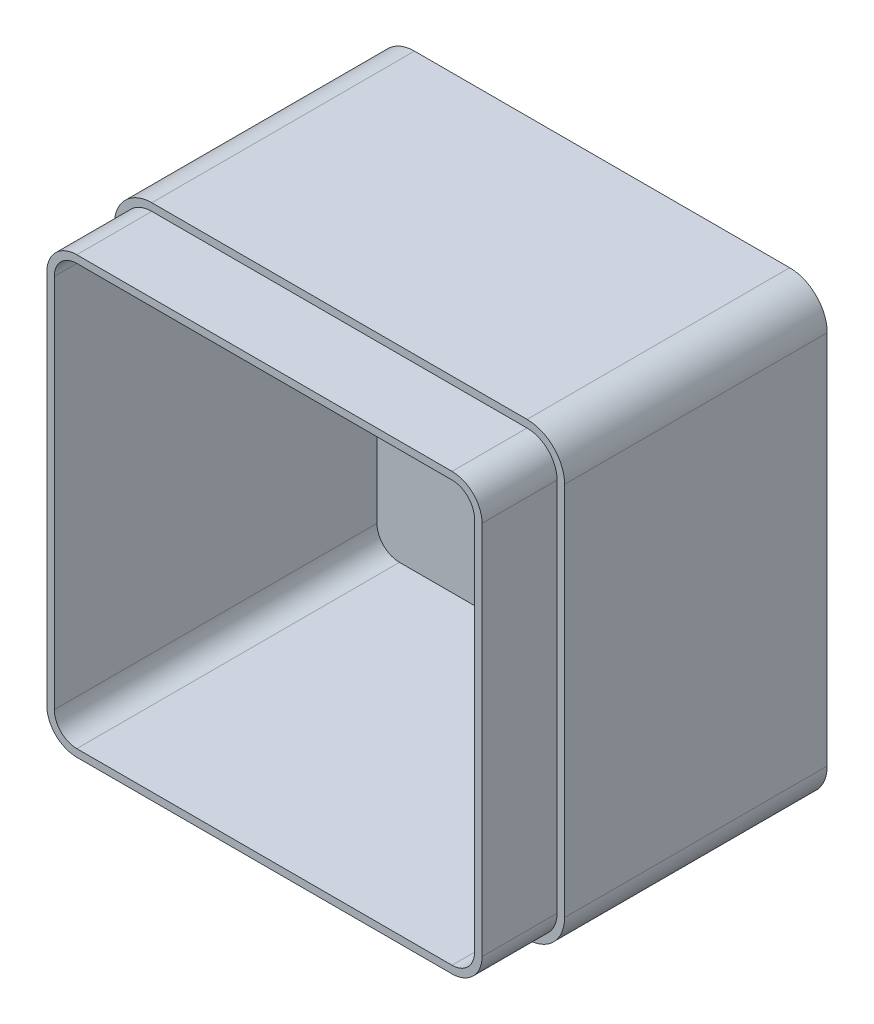
ISO-10303-21;
HEADER;
FILE_DESCRIPTION(('STEP AP214'),'2;1');
FILE_NAME('part.step','',(''),(''),'','','');
FILE_SCHEMA(('AUTOMOTIVE_DESIGN { 1 0 10303 214 1 1 1 1 }'));
ENDSEC;
DATA;
#1=APPLICATION_CONTEXT('core data for automotive mechanical design processes');
#2=APPLICATION_PROTOCOL_DEFINITION('international standard','automotive_design',2000,#1);
#3=PRODUCT_CONTEXT('',#1,'mechanical');
#4=PRODUCT('Part','Part','',(#3));
#5=PRODUCT_RELATED_PRODUCT_CATEGORY('part','',(#4));
#6=PRODUCT_DEFINITION_FORMATION('','',#4);
#7=PRODUCT_DEFINITION_CONTEXT('part definition',#1,'design');
#8=PRODUCT_DEFINITION('design','',#6,#7);
#9=PRODUCT_DEFINITION_SHAPE('','',#8);
#10=(LENGTH_UNIT() NAMED_UNIT(*) SI_UNIT(.MILLI.,.METRE.));
#11=(NAMED_UNIT(*) PLANE_ANGLE_UNIT() SI_UNIT($,.RADIAN.));
#12=(NAMED_UNIT(*) SI_UNIT($,.STERADIAN.) SOLID_ANGLE_UNIT());
#13=UNCERTAINTY_MEASURE_WITH_UNIT(LENGTH_MEASURE(1.E-05),#10,'distance_accuracy_value','');
#14=(GEOMETRIC_REPRESENTATION_CONTEXT(3) GLOBAL_UNCERTAINTY_ASSIGNED_CONTEXT((#13)) GLOBAL_UNIT_ASSIGNED_CONTEXT((#10,
#11,#12)) REPRESENTATION_CONTEXT('',''));
#15=CARTESIAN_POINT('',(0.,0.,0.));
#16=DIRECTION('',(0.,0.,1.));
#17=DIRECTION('',(1.,0.,0.));
#18=AXIS2_PLACEMENT_3D('',#15,#16,#17);
#19=CARTESIAN_POINT('',(0.,0.,90.));
#20=DIRECTION('',(0.,0.,1.));
#21=DIRECTION('',(1.,0.,0.));
#22=AXIS2_PLACEMENT_3D('',#19,#20,#21);
#23=PLANE('',#22);
#24=DIRECTION('',(0.,-1.,0.));
#25=VECTOR('',#24,1.);
#26=CARTESIAN_POINT('',(-116.,120.,90.));
#27=LINE('',#26,#25);
#28=CARTESIAN_POINT('',(-116.,110.,90.));
#29=VERTEX_POINT('',#28);
#30=CARTESIAN_POINT('',(-116.,9.99999999999999,90.));
#31=VERTEX_POINT('',#30);
#32=EDGE_CURVE('E349',#29,#31,#27,.T.);
#33=ORIENTED_EDGE('',*,*,#32,.F.);
#34=CARTESIAN_POINT('',(-110.,110.,90.));
#35=DIRECTION('',(0.,0.,1.));
#36=DIRECTION('',(1.,0.,0.));
#37=AXIS2_PLACEMENT_3D('',#34,#35,#36);
#38=CIRCLE('',#37,6.);
#39=CARTESIAN_POINT('',(-110.,116.,90.));
#40=VERTEX_POINT('',#39);
#41=EDGE_CURVE('E389',#40,#29,#38,.T.);
#42=ORIENTED_EDGE('',*,*,#41,.F.);
#43=DIRECTION('',(-1.,0.,0.));
#44=VECTOR('',#43,1.);
#45=CARTESIAN_POINT('',(-120.,116.,90.));
#46=LINE('',#45,#44);
#47=CARTESIAN_POINT('',(-10.,116.,90.));
#48=VERTEX_POINT('',#47);
#49=EDGE_CURVE('E365',#48,#40,#46,.T.);
#50=ORIENTED_EDGE('',*,*,#49,.F.);
#51=CARTESIAN_POINT('',(-9.99999999999999,110.,90.));
#52=DIRECTION('',(0.,0.,1.));
#53=DIRECTION('',(1.,0.,0.));
#54=AXIS2_PLACEMENT_3D('',#51,#52,#53);
#55=CIRCLE('',#54,6.);
#56=CARTESIAN_POINT('',(-4.,110.,90.));
#57=VERTEX_POINT('',#56);
#58=EDGE_CURVE('E396',#57,#48,#55,.T.);
#59=ORIENTED_EDGE('',*,*,#58,.F.);
#60=DIRECTION('',(0.,1.,0.));
#61=VECTOR('',#60,1.);
#62=CARTESIAN_POINT('',(-4.,120.,90.));
#63=LINE('',#62,#61);
#64=CARTESIAN_POINT('',(-4.,10.,90.));
#65=VERTEX_POINT('',#64);
#66=EDGE_CURVE('E393',#65,#57,#63,.T.);
#67=ORIENTED_EDGE('',*,*,#66,.F.);
#68=CARTESIAN_POINT('',(-10.,9.99999999999999,90.));
#69=DIRECTION('',(0.,0.,1.));
#70=DIRECTION('',(1.,0.,0.));
#71=AXIS2_PLACEMENT_3D('',#68,#69,#70);
#72=CIRCLE('',#71,6.);
#73=CARTESIAN_POINT('',(-9.99999999999999,4.,90.));
#74=VERTEX_POINT('',#73);
#75=EDGE_CURVE('E329',#74,#65,#72,.T.);
#76=ORIENTED_EDGE('',*,*,#75,.F.);
#77=DIRECTION('',(1.,0.,0.));
#78=VECTOR('',#77,1.);
#79=CARTESIAN_POINT('',(-120.,4.,90.));
#80=LINE('',#79,#78);
#81=CARTESIAN_POINT('',(-110.,4.,90.));
#82=VERTEX_POINT('',#81);
#83=EDGE_CURVE('E386',#82,#74,#80,.T.);
#84=ORIENTED_EDGE('',*,*,#83,.F.);
#85=CARTESIAN_POINT('',(-110.,10.,90.));
#86=DIRECTION('',(0.,0.,1.));
#87=DIRECTION('',(1.,0.,0.));
#88=AXIS2_PLACEMENT_3D('',#85,#86,#87);
#89=CIRCLE('',#88,6.);
#90=EDGE_CURVE('E379',#31,#82,#89,.T.);
#91=ORIENTED_EDGE('',*,*,#90,.F.);
#92=EDGE_LOOP('',(#33,#42,#50,#59,#67,#76,#84,#91));
#93=FACE_BOUND('',#92,.T.);
#94=DIRECTION('',(-1.,0.,0.));
#95=VECTOR('',#94,1.);
#96=CARTESIAN_POINT('',(-9.99999999999999,118.,90.));
#97=LINE('',#96,#95);
#98=CARTESIAN_POINT('',(-9.99999999999999,118.,90.));
#99=VERTEX_POINT('',#98);
#100=CARTESIAN_POINT('',(-110.,118.,90.));
#101=VERTEX_POINT('',#100);
#102=EDGE_CURVE('E230',#99,#101,#97,.T.);
#103=ORIENTED_EDGE('',*,*,#102,.T.);
#104=CARTESIAN_POINT('',(-110.,110.,90.));
#105=DIRECTION('',(0.,0.,1.));
#106=DIRECTION('',(1.,0.,0.));
#107=AXIS2_PLACEMENT_3D('',#104,#105,#106);
#108=CIRCLE('',#107,7.99999999999999);
#109=CARTESIAN_POINT('',(-118.,110.,90.));
#110=VERTEX_POINT('',#109);
#111=EDGE_CURVE('E257',#101,#110,#108,.T.);
#112=ORIENTED_EDGE('',*,*,#111,.T.);
#113=DIRECTION('',(0.,-1.,0.));
#114=VECTOR('',#113,1.);
#115=CARTESIAN_POINT('',(-118.,110.,90.));
#116=LINE('',#115,#114);
#117=CARTESIAN_POINT('',(-118.,9.99999999999999,90.));
#118=VERTEX_POINT('',#117);
#119=EDGE_CURVE('E207',#110,#118,#116,.T.);
#120=ORIENTED_EDGE('',*,*,#119,.T.);
#121=CARTESIAN_POINT('',(-110.,10.,90.));
#122=DIRECTION('',(0.,0.,1.));
#123=DIRECTION('',(1.,0.,0.));
#124=AXIS2_PLACEMENT_3D('',#121,#122,#123);
#125=CIRCLE('',#124,7.99999999999998);
#126=CARTESIAN_POINT('',(-110.,2.00000000000002,90.));
#127=VERTEX_POINT('',#126);
#128=EDGE_CURVE('E55',#118,#127,#125,.T.);
#129=ORIENTED_EDGE('',*,*,#128,.T.);
#130=DIRECTION('',(1.,0.,0.));
#131=VECTOR('',#130,1.);
#132=CARTESIAN_POINT('',(-110.,2.,90.));
#133=LINE('',#132,#131);
#134=CARTESIAN_POINT('',(-9.99999999999999,2.,90.));
#135=VERTEX_POINT('',#134);
#136=EDGE_CURVE('E264',#127,#135,#133,.T.);
#137=ORIENTED_EDGE('',*,*,#136,.T.);
#138=CARTESIAN_POINT('',(-10.,9.99999999999999,90.));
#139=DIRECTION('',(0.,0.,1.));
#140=DIRECTION('',(1.,0.,0.));
#141=AXIS2_PLACEMENT_3D('',#138,#139,#140);
#142=CIRCLE('',#141,8.);
#143=CARTESIAN_POINT('',(-2.,9.99999999999999,90.));
#144=VERTEX_POINT('',#143);
#145=EDGE_CURVE('E268',#135,#144,#142,.T.);
#146=ORIENTED_EDGE('',*,*,#145,.T.);
#147=DIRECTION('',(0.,1.,0.));
#148=VECTOR('',#147,1.);
#149=CARTESIAN_POINT('',(-2.,9.99999999999999,90.));
#150=LINE('',#149,#148);
#151=CARTESIAN_POINT('',(-2.,110.,90.));
#152=VERTEX_POINT('',#151);
#153=EDGE_CURVE('E272',#144,#152,#150,.T.);
#154=ORIENTED_EDGE('',*,*,#153,.T.);
#155=CARTESIAN_POINT('',(-9.99999999999999,110.,90.));
#156=DIRECTION('',(0.,0.,1.));
#157=DIRECTION('',(1.,0.,0.));
#158=AXIS2_PLACEMENT_3D('',#155,#156,#157);
#159=CIRCLE('',#158,7.99999999999999);
#160=EDGE_CURVE('E234',#152,#99,#159,.T.);
#161=ORIENTED_EDGE('',*,*,#160,.T.);
#162=EDGE_LOOP('',(#103,#112,#120,#129,#137,#146,#154,#161));
#163=FACE_BOUND('',#162,.T.);
#164=ADVANCED_FACE('F39',(#93,#163),#23,.T.);
#165=CARTESIAN_POINT('',(-116.,120.,90.));
#166=DIRECTION('',(1.,0.,0.));
#167=DIRECTION('',(0.,1.,0.));
#168=AXIS2_PLACEMENT_3D('',#165,#166,#167);
#169=PLANE('',#168);
#170=DIRECTION('',(0.,-1.,0.));
#171=VECTOR('',#170,1.);
#172=CARTESIAN_POINT('',(-116.,120.,4.));
#173=LINE('',#172,#171);
#174=CARTESIAN_POINT('',(-116.,110.,4.));
#175=VERTEX_POINT('',#174);
#176=CARTESIAN_POINT('',(-116.,9.99999999999999,4.));
#177=VERTEX_POINT('',#176);
#178=EDGE_CURVE('E321',#175,#177,#173,.T.);
#179=ORIENTED_EDGE('',*,*,#178,.F.);
#180=DIRECTION('',(0.,0.,1.));
#181=VECTOR('',#180,1.);
#182=CARTESIAN_POINT('',(-116.,110.,90.));
#183=LINE('',#182,#181);
#184=EDGE_CURVE('E330',#29,#175,#183,.F.);
#185=ORIENTED_EDGE('',*,*,#184,.F.);
#186=ORIENTED_EDGE('',*,*,#32,.T.);
#187=DIRECTION('',(0.,0.,1.));
#188=VECTOR('',#187,1.);
#189=CARTESIAN_POINT('',(-116.,9.99999999999999,90.));
#190=LINE('',#189,#188);
#191=EDGE_CURVE('E326',#177,#31,#190,.T.);
#192=ORIENTED_EDGE('',*,*,#191,.F.);
#193=EDGE_LOOP('',(#179,#185,#186,#192));
#194=FACE_BOUND('',#193,.T.);
#195=ADVANCED_FACE('F503',(#194),#169,.T.);
#196=CARTESIAN_POINT('',(-120.,4.,90.));
#197=DIRECTION('',(0.,1.,0.));
#198=DIRECTION('',(-1.,0.,0.));
#199=AXIS2_PLACEMENT_3D('',#196,#197,#198);
#200=PLANE('',#199);
#201=ORIENTED_EDGE('',*,*,#83,.T.);
#202=DIRECTION('',(0.,0.,1.));
#203=VECTOR('',#202,1.);
#204=CARTESIAN_POINT('',(-9.99999999999999,4.,90.));
#205=LINE('',#204,#203);
#206=CARTESIAN_POINT('',(-9.99999999999999,4.,4.));
#207=VERTEX_POINT('',#206);
#208=EDGE_CURVE('E362',#207,#74,#205,.T.);
#209=ORIENTED_EDGE('',*,*,#208,.F.);
#210=DIRECTION('',(1.,0.,0.));
#211=VECTOR('',#210,1.);
#212=CARTESIAN_POINT('',(-120.,4.,4.));
#213=LINE('',#212,#211);
#214=CARTESIAN_POINT('',(-110.,4.,4.));
#215=VERTEX_POINT('',#214);
#216=EDGE_CURVE('E325',#215,#207,#213,.T.);
#217=ORIENTED_EDGE('',*,*,#216,.F.);
#218=DIRECTION('',(0.,0.,1.));
#219=VECTOR('',#218,1.);
#220=CARTESIAN_POINT('',(-110.,4.,90.));
#221=LINE('',#220,#219);
#222=EDGE_CURVE('E358',#82,#215,#221,.F.);
#223=ORIENTED_EDGE('',*,*,#222,.F.);
#224=EDGE_LOOP('',(#201,#209,#217,#223));
#225=FACE_BOUND('',#224,.T.);
#226=ADVANCED_FACE('F509',(#225),#200,.T.);
#227=CARTESIAN_POINT('',(-4.,120.,90.));
#228=DIRECTION('',(-1.,0.,0.));
#229=DIRECTION('',(0.,0.,1.));
#230=AXIS2_PLACEMENT_3D('',#227,#228,#229);
#231=PLANE('',#230);
#232=DIRECTION('',(0.,1.,0.));
#233=VECTOR('',#232,1.);
#234=CARTESIAN_POINT('',(-4.,120.,4.));
#235=LINE('',#234,#233);
#236=CARTESIAN_POINT('',(-4.,10.,4.));
#237=VERTEX_POINT('',#236);
#238=CARTESIAN_POINT('',(-4.,110.,4.));
#239=VERTEX_POINT('',#238);
#240=EDGE_CURVE('E338',#237,#239,#235,.T.);
#241=ORIENTED_EDGE('',*,*,#240,.F.);
#242=DIRECTION('',(0.,0.,1.));
#243=VECTOR('',#242,1.);
#244=CARTESIAN_POINT('',(-4.,10.,90.));
#245=LINE('',#244,#243);
#246=EDGE_CURVE('E366',#65,#237,#245,.F.);
#247=ORIENTED_EDGE('',*,*,#246,.F.);
#248=ORIENTED_EDGE('',*,*,#66,.T.);
#249=DIRECTION('',(0.,0.,1.));
#250=VECTOR('',#249,1.);
#251=CARTESIAN_POINT('',(-4.,110.,90.));
#252=LINE('',#251,#250);
#253=EDGE_CURVE('E370',#239,#57,#252,.T.);
#254=ORIENTED_EDGE('',*,*,#253,.F.);
#255=EDGE_LOOP('',(#241,#247,#248,#254));
#256=FACE_BOUND('',#255,.T.);
#257=ADVANCED_FACE('F656',(#256),#231,.T.);
#258=CARTESIAN_POINT('',(-120.,116.,90.));
#259=DIRECTION('',(0.,-1.,0.));
#260=DIRECTION('',(0.,0.,-1.));
#261=AXIS2_PLACEMENT_3D('',#258,#259,#260);
#262=PLANE('',#261);
#263=DIRECTION('',(-1.,0.,0.));
#264=VECTOR('',#263,1.);
#265=CARTESIAN_POINT('',(-120.,116.,4.));
#266=LINE('',#265,#264);
#267=CARTESIAN_POINT('',(-10.,116.,4.));
#268=VERTEX_POINT('',#267);
#269=CARTESIAN_POINT('',(-110.,116.,4.));
#270=VERTEX_POINT('',#269);
#271=EDGE_CURVE('E345',#268,#270,#266,.T.);
#272=ORIENTED_EDGE('',*,*,#271,.F.);
#273=DIRECTION('',(0.,0.,-1.));
#274=VECTOR('',#273,1.);
#275=CARTESIAN_POINT('',(-10.,116.,90.));
#276=LINE('',#275,#274);
#277=EDGE_CURVE('E375',#48,#268,#276,.T.);
#278=ORIENTED_EDGE('',*,*,#277,.F.);
#279=ORIENTED_EDGE('',*,*,#49,.T.);
#280=DIRECTION('',(0.,0.,-1.));
#281=VECTOR('',#280,1.);
#282=CARTESIAN_POINT('',(-110.,116.,90.));
#283=LINE('',#282,#281);
#284=EDGE_CURVE('E371',#270,#40,#283,.F.);
#285=ORIENTED_EDGE('',*,*,#284,.F.);
#286=EDGE_LOOP('',(#272,#278,#279,#285));
#287=FACE_BOUND('',#286,.T.);
#288=ADVANCED_FACE('F648',(#287),#262,.T.);
#289=CARTESIAN_POINT('',(0.,0.,4.));
#290=DIRECTION('',(0.,0.,1.));
#291=DIRECTION('',(1.,0.,0.));
#292=AXIS2_PLACEMENT_3D('',#289,#290,#291);
#293=PLANE('',#292);
#294=ORIENTED_EDGE('',*,*,#216,.T.);
#295=CARTESIAN_POINT('',(-10.,9.99999999999999,4.));
#296=DIRECTION('',(0.,0.,1.));
#297=DIRECTION('',(1.,0.,0.));
#298=AXIS2_PLACEMENT_3D('',#295,#296,#297);
#299=CIRCLE('',#298,6.);
#300=EDGE_CURVE('E352',#237,#207,#299,.F.);
#301=ORIENTED_EDGE('',*,*,#300,.F.);
#302=ORIENTED_EDGE('',*,*,#240,.T.);
#303=CARTESIAN_POINT('',(-9.99999999999999,110.,4.));
#304=DIRECTION('',(0.,0.,1.));
#305=DIRECTION('',(1.,0.,0.));
#306=AXIS2_PLACEMENT_3D('',#303,#304,#305);
#307=CIRCLE('',#306,6.);
#308=EDGE_CURVE('E344',#268,#239,#307,.F.);
#309=ORIENTED_EDGE('',*,*,#308,.F.);
#310=ORIENTED_EDGE('',*,*,#271,.T.);
#311=CARTESIAN_POINT('',(-110.,110.,4.));
#312=DIRECTION('',(0.,0.,1.));
#313=DIRECTION('',(1.,0.,0.));
#314=AXIS2_PLACEMENT_3D('',#311,#312,#313);
#315=CIRCLE('',#314,6.);
#316=EDGE_CURVE('E341',#175,#270,#315,.F.);
#317=ORIENTED_EDGE('',*,*,#316,.F.);
#318=ORIENTED_EDGE('',*,*,#178,.T.);
#319=CARTESIAN_POINT('',(-110.,10.,4.));
#320=DIRECTION('',(0.,0.,1.));
#321=DIRECTION('',(1.,0.,0.));
#322=AXIS2_PLACEMENT_3D('',#319,#320,#321);
#323=CIRCLE('',#322,6.);
#324=EDGE_CURVE('E334',#215,#177,#323,.F.);
#325=ORIENTED_EDGE('',*,*,#324,.F.);
#326=EDGE_LOOP('',(#294,#301,#302,#309,#310,#317,#318,#325));
#327=FACE_BOUND('',#326,.T.);
#328=ADVANCED_FACE('F640',(#327),#293,.T.);
#329=CARTESIAN_POINT('',(-110.,10.,90.));
#330=DIRECTION('',(0.,0.,-1.));
#331=DIRECTION('',(-1.,0.,0.));
#332=AXIS2_PLACEMENT_3D('',#329,#330,#331);
#333=CYLINDRICAL_SURFACE('',#332,6.);
#334=ORIENTED_EDGE('',*,*,#90,.T.);
#335=ORIENTED_EDGE('',*,*,#222,.T.);
#336=ORIENTED_EDGE('',*,*,#324,.T.);
#337=ORIENTED_EDGE('',*,*,#191,.T.);
#338=EDGE_LOOP('',(#334,#335,#336,#337));
#339=FACE_BOUND('',#338,.T.);
#340=ADVANCED_FACE('F632',(#339),#333,.F.);
#341=CARTESIAN_POINT('',(-110.,110.,90.));
#342=DIRECTION('',(0.,0.,-1.));
#343=DIRECTION('',(-1.,0.,0.));
#344=AXIS2_PLACEMENT_3D('',#341,#342,#343);
#345=CYLINDRICAL_SURFACE('',#344,6.);
#346=ORIENTED_EDGE('',*,*,#41,.T.);
#347=ORIENTED_EDGE('',*,*,#184,.T.);
#348=ORIENTED_EDGE('',*,*,#316,.T.);
#349=ORIENTED_EDGE('',*,*,#284,.T.);
#350=EDGE_LOOP('',(#346,#347,#348,#349));
#351=FACE_BOUND('',#350,.T.);
#352=ADVANCED_FACE('F625',(#351),#345,.F.);
#353=CARTESIAN_POINT('',(-9.99999999999999,110.,90.));
#354=DIRECTION('',(0.,0.,-1.));
#355=DIRECTION('',(-1.,0.,0.));
#356=AXIS2_PLACEMENT_3D('',#353,#354,#355);
#357=CYLINDRICAL_SURFACE('',#356,6.);
#358=ORIENTED_EDGE('',*,*,#58,.T.);
#359=ORIENTED_EDGE('',*,*,#277,.T.);
#360=ORIENTED_EDGE('',*,*,#308,.T.);
#361=ORIENTED_EDGE('',*,*,#253,.T.);
#362=EDGE_LOOP('',(#358,#359,#360,#361));
#363=FACE_BOUND('',#362,.T.);
#364=ADVANCED_FACE('F618',(#363),#357,.F.);
#365=CARTESIAN_POINT('',(-10.,9.99999999999999,90.));
#366=DIRECTION('',(0.,0.,-1.));
#367=DIRECTION('',(-1.,0.,0.));
#368=AXIS2_PLACEMENT_3D('',#365,#366,#367);
#369=CYLINDRICAL_SURFACE('',#368,6.);
#370=ORIENTED_EDGE('',*,*,#75,.T.);
#371=ORIENTED_EDGE('',*,*,#246,.T.);
#372=ORIENTED_EDGE('',*,*,#300,.T.);
#373=ORIENTED_EDGE('',*,*,#208,.T.);
#374=EDGE_LOOP('',(#370,#371,#372,#373));
#375=FACE_BOUND('',#374,.T.);
#376=ADVANCED_FACE('F516',(#375),#369,.F.);
#377=CARTESIAN_POINT('',(-110.,110.,70.));
#378=DIRECTION('',(0.,0.,1.));
#379=DIRECTION('',(1.,0.,0.));
#380=AXIS2_PLACEMENT_3D('',#377,#378,#379);
#381=PLANE('',#380);
#382=DIRECTION('',(-1.,0.,0.));
#383=VECTOR('',#382,1.);
#384=CARTESIAN_POINT('',(-9.99999999999999,118.,70.));
#385=LINE('',#384,#383);
#386=CARTESIAN_POINT('',(-9.99999999999999,118.,70.));
#387=VERTEX_POINT('',#386);
#388=CARTESIAN_POINT('',(-110.,118.,70.));
#389=VERTEX_POINT('',#388);
#390=EDGE_CURVE('E214',#387,#389,#385,.T.);
#391=ORIENTED_EDGE('',*,*,#390,.F.);
#392=CARTESIAN_POINT('',(-9.99999999999999,110.,70.));
#393=DIRECTION('',(0.,0.,1.));
#394=DIRECTION('',(1.,0.,0.));
#395=AXIS2_PLACEMENT_3D('',#392,#393,#394);
#396=CIRCLE('',#395,7.99999999999999);
#397=CARTESIAN_POINT('',(-2.,110.,70.));
#398=VERTEX_POINT('',#397);
#399=EDGE_CURVE('E251',#398,#387,#396,.T.);
#400=ORIENTED_EDGE('',*,*,#399,.F.);
#401=DIRECTION('',(0.,1.,0.));
#402=VECTOR('',#401,1.);
#403=CARTESIAN_POINT('',(-2.,9.99999999999999,70.));
#404=LINE('',#403,#402);
#405=CARTESIAN_POINT('',(-2.,9.99999999999999,70.));
#406=VERTEX_POINT('',#405);
#407=EDGE_CURVE('E247',#406,#398,#404,.T.);
#408=ORIENTED_EDGE('',*,*,#407,.F.);
#409=CARTESIAN_POINT('',(-10.,9.99999999999999,70.));
#410=DIRECTION('',(0.,0.,1.));
#411=DIRECTION('',(1.,0.,0.));
#412=AXIS2_PLACEMENT_3D('',#409,#410,#411);
#413=CIRCLE('',#412,8.);
#414=CARTESIAN_POINT('',(-9.99999999999999,2.,70.));
#415=VERTEX_POINT('',#414);
#416=EDGE_CURVE('E243',#415,#406,#413,.T.);
#417=ORIENTED_EDGE('',*,*,#416,.F.);
#418=DIRECTION('',(1.,0.,0.));
#419=VECTOR('',#418,1.);
#420=CARTESIAN_POINT('',(-110.,2.,70.));
#421=LINE('',#420,#419);
#422=CARTESIAN_POINT('',(-110.,2.00000000000002,70.));
#423=VERTEX_POINT('',#422);
#424=EDGE_CURVE('E239',#423,#415,#421,.T.);
#425=ORIENTED_EDGE('',*,*,#424,.F.);
#426=CARTESIAN_POINT('',(-110.,10.,70.));
#427=DIRECTION('',(0.,0.,1.));
#428=DIRECTION('',(1.,0.,0.));
#429=AXIS2_PLACEMENT_3D('',#426,#427,#428);
#430=CIRCLE('',#429,7.99999999999998);
#431=CARTESIAN_POINT('',(-118.,9.99999999999999,70.));
#432=VERTEX_POINT('',#431);
#433=EDGE_CURVE('E224',#432,#423,#430,.T.);
#434=ORIENTED_EDGE('',*,*,#433,.F.);
#435=DIRECTION('',(0.,-1.,0.));
#436=VECTOR('',#435,1.);
#437=CARTESIAN_POINT('',(-118.,110.,70.));
#438=LINE('',#437,#436);
#439=CARTESIAN_POINT('',(-118.,110.,70.));
#440=VERTEX_POINT('',#439);
#441=EDGE_CURVE('E205',#440,#432,#438,.T.);
#442=ORIENTED_EDGE('',*,*,#441,.F.);
#443=CARTESIAN_POINT('',(-110.,110.,70.));
#444=DIRECTION('',(0.,0.,1.));
#445=DIRECTION('',(1.,0.,0.));
#446=AXIS2_PLACEMENT_3D('',#443,#444,#445);
#447=CIRCLE('',#446,7.99999999999999);
#448=EDGE_CURVE('E220',#389,#440,#447,.T.);
#449=ORIENTED_EDGE('',*,*,#448,.F.);
#450=EDGE_LOOP('',(#391,#400,#408,#417,#425,#434,#442,#449));
#451=FACE_BOUND('',#450,.T.);
#452=CARTESIAN_POINT('',(-110.,110.,70.));
#453=DIRECTION('',(0.,0.,1.));
#454=DIRECTION('',(1.,0.,0.));
#455=AXIS2_PLACEMENT_3D('',#452,#453,#454);
#456=CIRCLE('',#455,9.99999999999999);
#457=CARTESIAN_POINT('',(-110.,120.,70.));
#458=VERTEX_POINT('',#457);
#459=CARTESIAN_POINT('',(-120.,110.,70.));
#460=VERTEX_POINT('',#459);
#461=EDGE_CURVE('E281',#458,#460,#456,.T.);
#462=ORIENTED_EDGE('',*,*,#461,.T.);
#463=DIRECTION('',(0.,-1.,0.));
#464=VECTOR('',#463,1.);
#465=CARTESIAN_POINT('',(-120.,110.,70.));
#466=LINE('',#465,#464);
#467=CARTESIAN_POINT('',(-120.,9.99999999999999,70.));
#468=VERTEX_POINT('',#467);
#469=EDGE_CURVE('E301',#460,#468,#466,.T.);
#470=ORIENTED_EDGE('',*,*,#469,.T.);
#471=CARTESIAN_POINT('',(-110.,10.,70.));
#472=DIRECTION('',(0.,0.,1.));
#473=DIRECTION('',(1.,0.,0.));
#474=AXIS2_PLACEMENT_3D('',#471,#472,#473);
#475=CIRCLE('',#474,9.99999999999999);
#476=CARTESIAN_POINT('',(-110.,0.,70.));
#477=VERTEX_POINT('',#476);
#478=EDGE_CURVE('E304',#468,#477,#475,.T.);
#479=ORIENTED_EDGE('',*,*,#478,.T.);
#480=DIRECTION('',(1.,0.,0.));
#481=VECTOR('',#480,1.);
#482=CARTESIAN_POINT('',(-110.,0.,70.));
#483=LINE('',#482,#481);
#484=CARTESIAN_POINT('',(-9.99999999999999,0.,70.));
#485=VERTEX_POINT('',#484);
#486=EDGE_CURVE('E63',#477,#485,#483,.T.);
#487=ORIENTED_EDGE('',*,*,#486,.T.);
#488=CARTESIAN_POINT('',(-10.,9.99999999999999,70.));
#489=DIRECTION('',(0.,0.,1.));
#490=DIRECTION('',(1.,0.,0.));
#491=AXIS2_PLACEMENT_3D('',#488,#489,#490);
#492=CIRCLE('',#491,9.99999999999999);
#493=CARTESIAN_POINT('',(0.,9.99999999999999,70.));
#494=VERTEX_POINT('',#493);
#495=EDGE_CURVE('E309',#485,#494,#492,.T.);
#496=ORIENTED_EDGE('',*,*,#495,.T.);
#497=DIRECTION('',(0.,1.,0.));
#498=VECTOR('',#497,1.);
#499=CARTESIAN_POINT('',(0.,9.99999999999999,70.));
#500=LINE('',#499,#498);
#501=CARTESIAN_POINT('',(0.,110.,70.));
#502=VERTEX_POINT('',#501);
#503=EDGE_CURVE('E312',#494,#502,#500,.T.);
#504=ORIENTED_EDGE('',*,*,#503,.T.);
#505=CARTESIAN_POINT('',(-9.99999999999999,110.,70.));
#506=DIRECTION('',(0.,0.,1.));
#507=DIRECTION('',(1.,0.,0.));
#508=AXIS2_PLACEMENT_3D('',#505,#506,#507);
#509=CIRCLE('',#508,9.99999999999999);
#510=CARTESIAN_POINT('',(-9.99999999999999,120.,70.));
#511=VERTEX_POINT('',#510);
#512=EDGE_CURVE('E315',#502,#511,#509,.T.);
#513=ORIENTED_EDGE('',*,*,#512,.T.);
#514=DIRECTION('',(-1.,0.,0.));
#515=VECTOR('',#514,1.);
#516=CARTESIAN_POINT('',(-9.99999999999999,120.,70.));
#517=LINE('',#516,#515);
#518=EDGE_CURVE('E318',#511,#458,#517,.T.);
#519=ORIENTED_EDGE('',*,*,#518,.T.);
#520=EDGE_LOOP('',(#462,#470,#479,#487,#496,#504,#513,#519));
#521=FACE_BOUND('',#520,.T.);
#522=ADVANCED_FACE('F219',(#451,#521),#381,.T.);
#523=CARTESIAN_POINT('',(-110.,110.,70.));
#524=DIRECTION('',(0.,0.,1.));
#525=DIRECTION('',(1.,0.,0.));
#526=AXIS2_PLACEMENT_3D('',#523,#524,#525);
#527=CYLINDRICAL_SURFACE('',#526,7.99999999999999);
#528=ORIENTED_EDGE('',*,*,#111,.F.);
#529=DIRECTION('',(0.,0.,1.));
#530=VECTOR('',#529,1.);
#531=CARTESIAN_POINT('',(-110.,118.,70.));
#532=LINE('',#531,#530);
#533=EDGE_CURVE('E228',#389,#101,#532,.T.);
#534=ORIENTED_EDGE('',*,*,#533,.F.);
#535=ORIENTED_EDGE('',*,*,#448,.T.);
#536=DIRECTION('',(0.,0.,1.));
#537=VECTOR('',#536,1.);
#538=CARTESIAN_POINT('',(-118.,110.,70.));
#539=LINE('',#538,#537);
#540=EDGE_CURVE('E202',#440,#110,#539,.T.);
#541=ORIENTED_EDGE('',*,*,#540,.T.);
#542=EDGE_LOOP('',(#528,#534,#535,#541));
#543=FACE_BOUND('',#542,.T.);
#544=ADVANCED_FACE('F227',(#543),#527,.T.);
#545=CARTESIAN_POINT('',(-9.99999999999999,118.,70.));
#546=DIRECTION('',(0.,1.,0.));
#547=DIRECTION('',(0.,0.,1.));
#548=AXIS2_PLACEMENT_3D('',#545,#546,#547);
#549=PLANE('',#548);
#550=ORIENTED_EDGE('',*,*,#102,.F.);
#551=DIRECTION('',(0.,0.,1.));
#552=VECTOR('',#551,1.);
#553=CARTESIAN_POINT('',(-9.99999999999999,118.,70.));
#554=LINE('',#553,#552);
#555=EDGE_CURVE('E282',#387,#99,#554,.T.);
#556=ORIENTED_EDGE('',*,*,#555,.F.);
#557=ORIENTED_EDGE('',*,*,#390,.T.);
#558=ORIENTED_EDGE('',*,*,#533,.T.);
#559=EDGE_LOOP('',(#550,#556,#557,#558));
#560=FACE_BOUND('',#559,.T.);
#561=ADVANCED_FACE('F591',(#560),#549,.T.);
#562=CARTESIAN_POINT('',(-9.99999999999999,110.,70.));
#563=DIRECTION('',(0.,0.,1.));
#564=DIRECTION('',(1.,0.,0.));
#565=AXIS2_PLACEMENT_3D('',#562,#563,#564);
#566=CYLINDRICAL_SURFACE('',#565,7.99999999999999);
#567=ORIENTED_EDGE('',*,*,#160,.F.);
#568=DIRECTION('',(0.,0.,1.));
#569=VECTOR('',#568,1.);
#570=CARTESIAN_POINT('',(-2.,110.,70.));
#571=LINE('',#570,#569);
#572=EDGE_CURVE('E285',#398,#152,#571,.T.);
#573=ORIENTED_EDGE('',*,*,#572,.F.);
#574=ORIENTED_EDGE('',*,*,#399,.T.);
#575=ORIENTED_EDGE('',*,*,#555,.T.);
#576=EDGE_LOOP('',(#567,#573,#574,#575));
#577=FACE_BOUND('',#576,.T.);
#578=ADVANCED_FACE('F583',(#577),#566,.T.);
#579=CARTESIAN_POINT('',(-2.,9.99999999999999,70.));
#580=DIRECTION('',(1.,0.,0.));
#581=DIRECTION('',(0.,1.,0.));
#582=AXIS2_PLACEMENT_3D('',#579,#580,#581);
#583=PLANE('',#582);
#584=ORIENTED_EDGE('',*,*,#153,.F.);
#585=DIRECTION('',(0.,0.,1.));
#586=VECTOR('',#585,1.);
#587=CARTESIAN_POINT('',(-2.,9.99999999999999,70.));
#588=LINE('',#587,#586);
#589=EDGE_CURVE('E288',#406,#144,#588,.T.);
#590=ORIENTED_EDGE('',*,*,#589,.F.);
#591=ORIENTED_EDGE('',*,*,#407,.T.);
#592=ORIENTED_EDGE('',*,*,#572,.T.);
#593=EDGE_LOOP('',(#584,#590,#591,#592));
#594=FACE_BOUND('',#593,.T.);
#595=ADVANCED_FACE('F575',(#594),#583,.T.);
#596=CARTESIAN_POINT('',(-10.,9.99999999999999,70.));
#597=DIRECTION('',(0.,0.,1.));
#598=DIRECTION('',(1.,0.,0.));
#599=AXIS2_PLACEMENT_3D('',#596,#597,#598);
#600=CYLINDRICAL_SURFACE('',#599,8.);
#601=ORIENTED_EDGE('',*,*,#145,.F.);
#602=DIRECTION('',(0.,0.,1.));
#603=VECTOR('',#602,1.);
#604=CARTESIAN_POINT('',(-9.99999999999999,2.,70.));
#605=LINE('',#604,#603);
#606=EDGE_CURVE('E291',#415,#135,#605,.T.);
#607=ORIENTED_EDGE('',*,*,#606,.F.);
#608=ORIENTED_EDGE('',*,*,#416,.T.);
#609=ORIENTED_EDGE('',*,*,#589,.T.);
#610=EDGE_LOOP('',(#601,#607,#608,#609));
#611=FACE_BOUND('',#610,.T.);
#612=ADVANCED_FACE('F567',(#611),#600,.T.);
#613=CARTESIAN_POINT('',(-110.,2.,70.));
#614=DIRECTION('',(0.,-1.,0.));
#615=DIRECTION('',(1.,0.,0.));
#616=AXIS2_PLACEMENT_3D('',#613,#614,#615);
#617=PLANE('',#616);
#618=ORIENTED_EDGE('',*,*,#136,.F.);
#619=DIRECTION('',(0.,0.,1.));
#620=VECTOR('',#619,1.);
#621=CARTESIAN_POINT('',(-110.,2.00000000000002,70.));
#622=LINE('',#621,#620);
#623=EDGE_CURVE('E294',#423,#127,#622,.T.);
#624=ORIENTED_EDGE('',*,*,#623,.F.);
#625=ORIENTED_EDGE('',*,*,#424,.T.);
#626=ORIENTED_EDGE('',*,*,#606,.T.);
#627=EDGE_LOOP('',(#618,#624,#625,#626));
#628=FACE_BOUND('',#627,.T.);
#629=ADVANCED_FACE('F560',(#628),#617,.T.);
#630=CARTESIAN_POINT('',(-110.,10.,70.));
#631=DIRECTION('',(0.,0.,1.));
#632=DIRECTION('',(1.,0.,0.));
#633=AXIS2_PLACEMENT_3D('',#630,#631,#632);
#634=CYLINDRICAL_SURFACE('',#633,7.99999999999998);
#635=ORIENTED_EDGE('',*,*,#128,.F.);
#636=DIRECTION('',(0.,0.,1.));
#637=VECTOR('',#636,1.);
#638=CARTESIAN_POINT('',(-118.,9.99999999999999,70.));
#639=LINE('',#638,#637);
#640=EDGE_CURVE('E213',#432,#118,#639,.T.);
#641=ORIENTED_EDGE('',*,*,#640,.F.);
#642=ORIENTED_EDGE('',*,*,#433,.T.);
#643=ORIENTED_EDGE('',*,*,#623,.T.);
#644=EDGE_LOOP('',(#635,#641,#642,#643));
#645=FACE_BOUND('',#644,.T.);
#646=ADVANCED_FACE('F553',(#645),#634,.T.);
#647=CARTESIAN_POINT('',(-118.,110.,70.));
#648=DIRECTION('',(-1.,0.,0.));
#649=DIRECTION('',(0.,0.,1.));
#650=AXIS2_PLACEMENT_3D('',#647,#648,#649);
#651=PLANE('',#650);
#652=ORIENTED_EDGE('',*,*,#119,.F.);
#653=ORIENTED_EDGE('',*,*,#540,.F.);
#654=ORIENTED_EDGE('',*,*,#441,.T.);
#655=ORIENTED_EDGE('',*,*,#640,.T.);
#656=EDGE_LOOP('',(#652,#653,#654,#655));
#657=FACE_BOUND('',#656,.T.);
#658=ADVANCED_FACE('F204',(#657),#651,.T.);
#659=CARTESIAN_POINT('',(0.,0.,0.));
#660=DIRECTION('',(0.,0.,1.));
#661=DIRECTION('',(1.,0.,0.));
#662=AXIS2_PLACEMENT_3D('',#659,#660,#661);
#663=PLANE('',#662);
#664=DIRECTION('',(1.,0.,0.));
#665=VECTOR('',#664,1.);
#666=CARTESIAN_POINT('',(-120.,0.,0.));
#667=LINE('',#666,#665);
#668=CARTESIAN_POINT('',(-110.,0.,0.));
#669=VERTEX_POINT('',#668);
#670=CARTESIAN_POINT('',(-9.99999999999999,0.,0.));
#671=VERTEX_POINT('',#670);
#672=EDGE_CURVE('E409',#669,#671,#667,.T.);
#673=ORIENTED_EDGE('',*,*,#672,.F.);
#674=CARTESIAN_POINT('',(-110.,10.,0.));
#675=DIRECTION('',(0.,0.,1.));
#676=DIRECTION('',(1.,0.,0.));
#677=AXIS2_PLACEMENT_3D('',#674,#675,#676);
#678=CIRCLE('',#677,10.);
#679=CARTESIAN_POINT('',(-120.,9.99999999999999,0.));
#680=VERTEX_POINT('',#679);
#681=EDGE_CURVE('E437',#669,#680,#678,.F.);
#682=ORIENTED_EDGE('',*,*,#681,.T.);
#683=DIRECTION('',(0.,-1.,0.));
#684=VECTOR('',#683,1.);
#685=CARTESIAN_POINT('',(-120.,120.,0.));
#686=LINE('',#685,#684);
#687=CARTESIAN_POINT('',(-120.,110.,0.));
#688=VERTEX_POINT('',#687);
#689=EDGE_CURVE('E374',#688,#680,#686,.T.);
#690=ORIENTED_EDGE('',*,*,#689,.F.);
#691=CARTESIAN_POINT('',(-110.,110.,0.));
#692=DIRECTION('',(0.,0.,1.));
#693=DIRECTION('',(1.,0.,0.));
#694=AXIS2_PLACEMENT_3D('',#691,#692,#693);
#695=CIRCLE('',#694,10.);
#696=CARTESIAN_POINT('',(-110.,120.,0.));
#697=VERTEX_POINT('',#696);
#698=EDGE_CURVE('E434',#688,#697,#695,.F.);
#699=ORIENTED_EDGE('',*,*,#698,.T.);
#700=DIRECTION('',(-1.,0.,0.));
#701=VECTOR('',#700,1.);
#702=CARTESIAN_POINT('',(-120.,120.,0.));
#703=LINE('',#702,#701);
#704=CARTESIAN_POINT('',(-9.99999999999999,120.,0.));
#705=VERTEX_POINT('',#704);
#706=EDGE_CURVE('E417',#705,#697,#703,.T.);
#707=ORIENTED_EDGE('',*,*,#706,.F.);
#708=CARTESIAN_POINT('',(-9.99999999999999,110.,0.));
#709=DIRECTION('',(0.,0.,1.));
#710=DIRECTION('',(1.,0.,0.));
#711=AXIS2_PLACEMENT_3D('',#708,#709,#710);
#712=CIRCLE('',#711,10.);
#713=CARTESIAN_POINT('',(0.,110.,0.));
#714=VERTEX_POINT('',#713);
#715=EDGE_CURVE('E431',#705,#714,#712,.F.);
#716=ORIENTED_EDGE('',*,*,#715,.T.);
#717=DIRECTION('',(0.,1.,0.));
#718=VECTOR('',#717,1.);
#719=CARTESIAN_POINT('',(0.,120.,0.));
#720=LINE('',#719,#718);
#721=CARTESIAN_POINT('',(0.,9.99999999999999,0.));
#722=VERTEX_POINT('',#721);
#723=EDGE_CURVE('E413',#722,#714,#720,.T.);
#724=ORIENTED_EDGE('',*,*,#723,.F.);
#725=CARTESIAN_POINT('',(-10.,9.99999999999999,0.));
#726=DIRECTION('',(0.,0.,1.));
#727=DIRECTION('',(1.,0.,0.));
#728=AXIS2_PLACEMENT_3D('',#725,#726,#727);
#729=CIRCLE('',#728,10.);
#730=EDGE_CURVE('E428',#722,#671,#729,.F.);
#731=ORIENTED_EDGE('',*,*,#730,.T.);
#732=EDGE_LOOP('',(#673,#682,#690,#699,#707,#716,#724,#731));
#733=FACE_BOUND('',#732,.T.);
#734=ADVANCED_FACE('F465',(#733),#663,.F.);
#735=CARTESIAN_POINT('',(-110.,110.,90.));
#736=DIRECTION('',(0.,0.,-1.));
#737=DIRECTION('',(-1.,0.,0.));
#738=AXIS2_PLACEMENT_3D('',#735,#736,#737);
#739=CYLINDRICAL_SURFACE('',#738,10.);
#740=DIRECTION('',(0.,0.,-1.));
#741=VECTOR('',#740,1.);
#742=CARTESIAN_POINT('',(-120.,110.,90.));
#743=LINE('',#742,#741);
#744=EDGE_CURVE('E440',#460,#688,#743,.T.);
#745=ORIENTED_EDGE('',*,*,#744,.F.);
#746=ORIENTED_EDGE('',*,*,#461,.F.);
#747=DIRECTION('',(0.,0.,-1.));
#748=VECTOR('',#747,1.);
#749=CARTESIAN_POINT('',(-110.,120.,90.));
#750=LINE('',#749,#748);
#751=EDGE_CURVE('E450',#697,#458,#750,.F.);
#752=ORIENTED_EDGE('',*,*,#751,.F.);
#753=ORIENTED_EDGE('',*,*,#698,.F.);
#754=EDGE_LOOP('',(#745,#746,#752,#753));
#755=FACE_BOUND('',#754,.T.);
#756=ADVANCED_FACE('F480',(#755),#739,.T.);
#757=CARTESIAN_POINT('',(-9.99999999999999,110.,90.));
#758=DIRECTION('',(0.,0.,-1.));
#759=DIRECTION('',(-1.,0.,0.));
#760=AXIS2_PLACEMENT_3D('',#757,#758,#759);
#761=CYLINDRICAL_SURFACE('',#760,10.);
#762=DIRECTION('',(0.,0.,-1.));
#763=VECTOR('',#762,1.);
#764=CARTESIAN_POINT('',(-9.99999999999999,120.,90.));
#765=LINE('',#764,#763);
#766=EDGE_CURVE('E447',#511,#705,#765,.T.);
#767=ORIENTED_EDGE('',*,*,#766,.F.);
#768=ORIENTED_EDGE('',*,*,#512,.F.);
#769=DIRECTION('',(0.,0.,-1.));
#770=VECTOR('',#769,1.);
#771=CARTESIAN_POINT('',(0.,110.,90.));
#772=LINE('',#771,#770);
#773=EDGE_CURVE('E11',#714,#502,#772,.F.);
#774=ORIENTED_EDGE('',*,*,#773,.F.);
#775=ORIENTED_EDGE('',*,*,#715,.F.);
#776=EDGE_LOOP('',(#767,#768,#774,#775));
#777=FACE_BOUND('',#776,.T.);
#778=ADVANCED_FACE('F470',(#777),#761,.T.);
#779=CARTESIAN_POINT('',(-120.,120.,90.));
#780=DIRECTION('',(0.,-1.,0.));
#781=DIRECTION('',(0.,0.,-1.));
#782=AXIS2_PLACEMENT_3D('',#779,#780,#781);
#783=PLANE('',#782);
#784=ORIENTED_EDGE('',*,*,#518,.F.);
#785=ORIENTED_EDGE('',*,*,#766,.T.);
#786=ORIENTED_EDGE('',*,*,#706,.T.);
#787=ORIENTED_EDGE('',*,*,#751,.T.);
#788=EDGE_LOOP('',(#784,#785,#786,#787));
#789=FACE_BOUND('',#788,.T.);
#790=ADVANCED_FACE('F475',(#789),#783,.F.);
#791=CARTESIAN_POINT('',(-10.,9.99999999999999,90.));
#792=DIRECTION('',(0.,0.,-1.));
#793=DIRECTION('',(-1.,0.,0.));
#794=AXIS2_PLACEMENT_3D('',#791,#792,#793);
#795=CYLINDRICAL_SURFACE('',#794,10.);
#796=DIRECTION('',(0.,0.,-1.));
#797=VECTOR('',#796,1.);
#798=CARTESIAN_POINT('',(0.,9.99999999999999,90.));
#799=LINE('',#798,#797);
#800=EDGE_CURVE('E48',#494,#722,#799,.T.);
#801=ORIENTED_EDGE('',*,*,#800,.F.);
#802=ORIENTED_EDGE('',*,*,#495,.F.);
#803=DIRECTION('',(0.,0.,-1.));
#804=VECTOR('',#803,1.);
#805=CARTESIAN_POINT('',(-9.99999999999999,0.,90.));
#806=LINE('',#805,#804);
#807=EDGE_CURVE('E421',#671,#485,#806,.F.);
#808=ORIENTED_EDGE('',*,*,#807,.F.);
#809=ORIENTED_EDGE('',*,*,#730,.F.);
#810=EDGE_LOOP('',(#801,#802,#808,#809));
#811=FACE_BOUND('',#810,.T.);
#812=ADVANCED_FACE('F41',(#811),#795,.T.);
#813=CARTESIAN_POINT('',(0.,120.,90.));
#814=DIRECTION('',(-1.,0.,0.));
#815=DIRECTION('',(0.,0.,1.));
#816=AXIS2_PLACEMENT_3D('',#813,#814,#815);
#817=PLANE('',#816);
#818=ORIENTED_EDGE('',*,*,#503,.F.);
#819=ORIENTED_EDGE('',*,*,#800,.T.);
#820=ORIENTED_EDGE('',*,*,#723,.T.);
#821=ORIENTED_EDGE('',*,*,#773,.T.);
#822=EDGE_LOOP('',(#818,#819,#820,#821));
#823=FACE_BOUND('',#822,.T.);
#824=ADVANCED_FACE('F458',(#823),#817,.F.);
#825=CARTESIAN_POINT('',(-110.,10.,90.));
#826=DIRECTION('',(0.,0.,-1.));
#827=DIRECTION('',(-1.,0.,0.));
#828=AXIS2_PLACEMENT_3D('',#825,#826,#827);
#829=CYLINDRICAL_SURFACE('',#828,10.);
#830=DIRECTION('',(0.,0.,-1.));
#831=VECTOR('',#830,1.);
#832=CARTESIAN_POINT('',(-110.,0.,90.));
#833=LINE('',#832,#831);
#834=EDGE_CURVE('E425',#477,#669,#833,.T.);
#835=ORIENTED_EDGE('',*,*,#834,.F.);
#836=ORIENTED_EDGE('',*,*,#478,.F.);
#837=DIRECTION('',(0.,0.,-1.));
#838=VECTOR('',#837,1.);
#839=CARTESIAN_POINT('',(-120.,9.99999999999999,90.));
#840=LINE('',#839,#838);
#841=EDGE_CURVE('E443',#680,#468,#840,.F.);
#842=ORIENTED_EDGE('',*,*,#841,.F.);
#843=ORIENTED_EDGE('',*,*,#681,.F.);
#844=EDGE_LOOP('',(#835,#836,#842,#843));
#845=FACE_BOUND('',#844,.T.);
#846=ADVANCED_FACE('F490',(#845),#829,.T.);
#847=CARTESIAN_POINT('',(-120.,0.,90.));
#848=DIRECTION('',(0.,1.,0.));
#849=DIRECTION('',(-1.,0.,0.));
#850=AXIS2_PLACEMENT_3D('',#847,#848,#849);
#851=PLANE('',#850);
#852=ORIENTED_EDGE('',*,*,#486,.F.);
#853=ORIENTED_EDGE('',*,*,#834,.T.);
#854=ORIENTED_EDGE('',*,*,#672,.T.);
#855=ORIENTED_EDGE('',*,*,#807,.T.);
#856=EDGE_LOOP('',(#852,#853,#854,#855));
#857=FACE_BOUND('',#856,.T.);
#858=ADVANCED_FACE('F492',(#857),#851,.F.);
#859=CARTESIAN_POINT('',(-120.,120.,90.));
#860=DIRECTION('',(1.,0.,0.));
#861=DIRECTION('',(0.,1.,0.));
#862=AXIS2_PLACEMENT_3D('',#859,#860,#861);
#863=PLANE('',#862);
#864=ORIENTED_EDGE('',*,*,#469,.F.);
#865=ORIENTED_EDGE('',*,*,#744,.T.);
#866=ORIENTED_EDGE('',*,*,#689,.T.);
#867=ORIENTED_EDGE('',*,*,#841,.T.);
#868=EDGE_LOOP('',(#864,#865,#866,#867));
#869=FACE_BOUND('',#868,.T.);
#870=ADVANCED_FACE('F485',(#869),#863,.F.);
#871=CLOSED_SHELL('',(#164,#195,#226,#257,#288,#328,#340,#352,#364,#376,#522,#544,#561,#578,
#595,#612,#629,#646,#658,#734,#756,#778,#790,#812,#824,#846,#858,#870));
#872=MANIFOLD_SOLID_BREP('B2',#871);
#873=ADVANCED_BREP_SHAPE_REPRESENTATION('',(#18,#872),#14);
#874=SHAPE_DEFINITION_REPRESENTATION(#9,#873);
ENDSEC;
END-ISO-10303-21;
